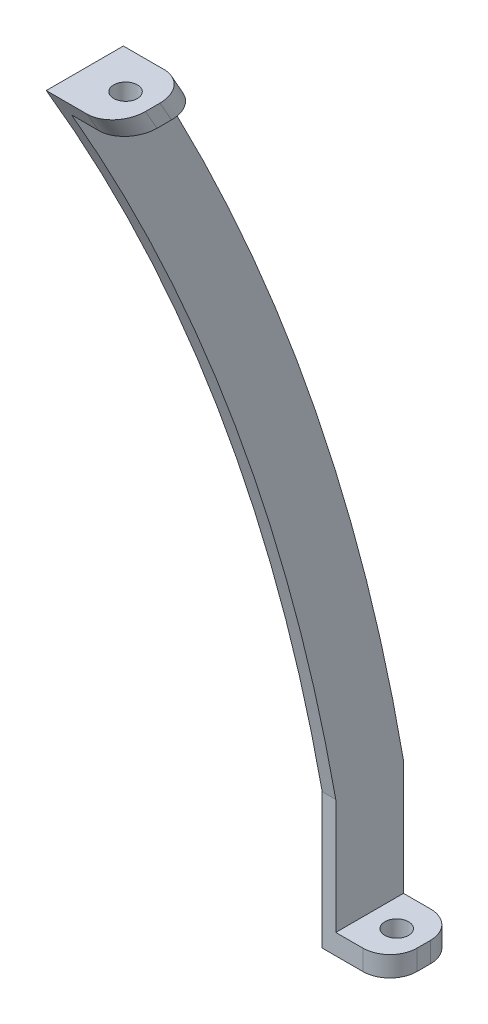
ISO-10303-21;
HEADER;
FILE_DESCRIPTION(('STEP AP214'),'2;1');
FILE_NAME('part.step','',(''),(''),'','','');
FILE_SCHEMA(('AUTOMOTIVE_DESIGN { 1 0 10303 214 1 1 1 1 }'));
ENDSEC;
DATA;
#1=APPLICATION_CONTEXT('core data for automotive mechanical design processes');
#2=APPLICATION_PROTOCOL_DEFINITION('international standard','automotive_design',2000,#1);
#3=PRODUCT_CONTEXT('',#1,'mechanical');
#4=PRODUCT('Part','Part','',(#3));
#5=PRODUCT_RELATED_PRODUCT_CATEGORY('part','',(#4));
#6=PRODUCT_DEFINITION_FORMATION('','',#4);
#7=PRODUCT_DEFINITION_CONTEXT('part definition',#1,'design');
#8=PRODUCT_DEFINITION('design','',#6,#7);
#9=PRODUCT_DEFINITION_SHAPE('','',#8);
#10=(LENGTH_UNIT() NAMED_UNIT(*) SI_UNIT(.MILLI.,.METRE.));
#11=(NAMED_UNIT(*) PLANE_ANGLE_UNIT() SI_UNIT($,.RADIAN.));
#12=(NAMED_UNIT(*) SI_UNIT($,.STERADIAN.) SOLID_ANGLE_UNIT());
#13=UNCERTAINTY_MEASURE_WITH_UNIT(LENGTH_MEASURE(1.E-05),#10,'distance_accuracy_value','');
#14=(GEOMETRIC_REPRESENTATION_CONTEXT(3) GLOBAL_UNCERTAINTY_ASSIGNED_CONTEXT((#13)) GLOBAL_UNIT_ASSIGNED_CONTEXT((#10,
#11,#12)) REPRESENTATION_CONTEXT('',''));
#15=CARTESIAN_POINT('',(0.,0.,0.));
#16=DIRECTION('',(0.,0.,1.));
#17=DIRECTION('',(1.,0.,0.));
#18=AXIS2_PLACEMENT_3D('',#15,#16,#17);
#19=CARTESIAN_POINT('',(2.,-37.6515685831569,324.556822155279));
#20=DIRECTION('',(1.,0.,0.));
#21=DIRECTION('',(0.,0.,-1.));
#22=AXIS2_PLACEMENT_3D('',#19,#20,#21);
#23=PLANE('',#22);
#24=CARTESIAN_POINT('',(2.,-37.6515685831569,324.556822155279));
#25=DIRECTION('',(1.,0.,0.));
#26=DIRECTION('',(0.,0.,-1.));
#27=AXIS2_PLACEMENT_3D('',#24,#25,#26);
#28=CIRCLE('',#27,339.487806276952);
#29=CARTESIAN_POINT('',(2.,20.,-10.));
#30=VERTEX_POINT('',#29);
#31=CARTESIAN_POINT('',(2.,127.,27.6699218483719));
#32=VERTEX_POINT('',#31);
#33=EDGE_CURVE('E193',#30,#32,#28,.T.);
#34=ORIENTED_EDGE('',*,*,#33,.T.);
#35=DIRECTION('',(0.,0.,-1.));
#36=VECTOR('',#35,1.);
#37=CARTESIAN_POINT('',(2.,127.,38.9859988368982));
#38=LINE('',#37,#36);
#39=CARTESIAN_POINT('',(2.,127.,38.9859988368982));
#40=VERTEX_POINT('',#39);
#41=EDGE_CURVE('E177',#40,#32,#38,.T.);
#42=ORIENTED_EDGE('',*,*,#41,.F.);
#43=CARTESIAN_POINT('',(2.,-37.6515685831569,324.556822155279));
#44=DIRECTION('',(-1.,0.,0.));
#45=DIRECTION('',(0.,0.,-1.));
#46=AXIS2_PLACEMENT_3D('',#43,#44,#45);
#47=CIRCLE('',#46,329.637428347619);
#48=CARTESIAN_POINT('',(2.,20.,0.));
#49=VERTEX_POINT('',#48);
#50=EDGE_CURVE('E167',#40,#49,#47,.T.);
#51=ORIENTED_EDGE('',*,*,#50,.T.);
#52=DIRECTION('',(0.,-1.,0.));
#53=VECTOR('',#52,1.);
#54=CARTESIAN_POINT('',(2.,0.,0.));
#55=LINE('',#54,#53);
#56=CARTESIAN_POINT('',(2.,3.,0.));
#57=VERTEX_POINT('',#56);
#58=EDGE_CURVE('E151',#49,#57,#55,.T.);
#59=ORIENTED_EDGE('',*,*,#58,.T.);
#60=DIRECTION('',(0.,0.,1.));
#61=VECTOR('',#60,1.);
#62=CARTESIAN_POINT('',(2.,3.,0.));
#63=LINE('',#62,#61);
#64=CARTESIAN_POINT('',(2.,3.,-10.));
#65=VERTEX_POINT('',#64);
#66=EDGE_CURVE('E163',#65,#57,#63,.T.);
#67=ORIENTED_EDGE('',*,*,#66,.F.);
#68=DIRECTION('',(0.,1.,0.));
#69=VECTOR('',#68,1.);
#70=CARTESIAN_POINT('',(2.,0.,-10.));
#71=LINE('',#70,#69);
#72=EDGE_CURVE('E170',#65,#30,#71,.T.);
#73=ORIENTED_EDGE('',*,*,#72,.T.);
#74=EDGE_LOOP('',(#34,#42,#51,#59,#67,#73));
#75=FACE_BOUND('',#74,.T.);
#76=ADVANCED_FACE('F43',(#75),#23,.T.);
#77=CARTESIAN_POINT('',(2.,0.,0.));
#78=DIRECTION('',(0.,0.,-1.));
#79=DIRECTION('',(-1.,0.,0.));
#80=AXIS2_PLACEMENT_3D('',#77,#78,#79);
#81=PLANE('',#80);
#82=DIRECTION('',(-1.,0.,0.));
#83=VECTOR('',#82,1.);
#84=CARTESIAN_POINT('',(2.,0.,0.));
#85=LINE('',#84,#83);
#86=CARTESIAN_POINT('',(6.,0.,0.));
#87=VERTEX_POINT('',#86);
#88=CARTESIAN_POINT('',(0.,0.,0.));
#89=VERTEX_POINT('',#88);
#90=EDGE_CURVE('E234',#87,#89,#85,.T.);
#91=ORIENTED_EDGE('',*,*,#90,.F.);
#92=DIRECTION('',(0.,-1.,0.));
#93=VECTOR('',#92,1.);
#94=CARTESIAN_POINT('',(6.,0.,0.));
#95=LINE('',#94,#93);
#96=CARTESIAN_POINT('',(6.,3.,0.));
#97=VERTEX_POINT('',#96);
#98=EDGE_CURVE('E11',#87,#97,#95,.F.);
#99=ORIENTED_EDGE('',*,*,#98,.T.);
#100=DIRECTION('',(-1.,0.,0.));
#101=VECTOR('',#100,1.);
#102=CARTESIAN_POINT('',(10.,3.,0.));
#103=LINE('',#102,#101);
#104=EDGE_CURVE('E147',#97,#57,#103,.T.);
#105=ORIENTED_EDGE('',*,*,#104,.T.);
#106=ORIENTED_EDGE('',*,*,#58,.F.);
#107=DIRECTION('',(-1.,0.,0.));
#108=VECTOR('',#107,1.);
#109=CARTESIAN_POINT('',(2.,20.,0.));
#110=LINE('',#109,#108);
#111=CARTESIAN_POINT('',(0.,20.,0.));
#112=VERTEX_POINT('',#111);
#113=EDGE_CURVE('E198',#49,#112,#110,.T.);
#114=ORIENTED_EDGE('',*,*,#113,.T.);
#115=DIRECTION('',(0.,-1.,0.));
#116=VECTOR('',#115,1.);
#117=CARTESIAN_POINT('',(0.,0.,0.));
#118=LINE('',#117,#116);
#119=EDGE_CURVE('E189',#112,#89,#118,.T.);
#120=ORIENTED_EDGE('',*,*,#119,.T.);
#121=EDGE_LOOP('',(#91,#99,#105,#106,#114,#120));
#122=FACE_BOUND('',#121,.T.);
#123=ADVANCED_FACE('F149',(#122),#81,.F.);
#124=CARTESIAN_POINT('',(2.,0.,0.));
#125=DIRECTION('',(0.,1.,0.));
#126=DIRECTION('',(0.,0.,1.));
#127=AXIS2_PLACEMENT_3D('',#124,#125,#126);
#128=PLANE('',#127);
#129=CARTESIAN_POINT('',(6.,0.,-5.));
#130=DIRECTION('',(0.,1.,0.));
#131=DIRECTION('',(0.,0.,1.));
#132=AXIS2_PLACEMENT_3D('',#129,#130,#131);
#133=CIRCLE('',#132,1.75);
#134=CARTESIAN_POINT('',(6.,0.,-3.25));
#135=VERTEX_POINT('',#134);
#136=EDGE_CURVE('E364',#135,#135,#133,.T.);
#137=ORIENTED_EDGE('',*,*,#136,.T.);
#138=EDGE_LOOP('',(#137));
#139=FACE_BOUND('',#138,.T.);
#140=DIRECTION('',(-1.,0.,0.));
#141=VECTOR('',#140,1.);
#142=CARTESIAN_POINT('',(2.,0.,-10.));
#143=LINE('',#142,#141);
#144=CARTESIAN_POINT('',(6.,0.,-10.));
#145=VERTEX_POINT('',#144);
#146=CARTESIAN_POINT('',(0.,0.,-10.));
#147=VERTEX_POINT('',#146);
#148=EDGE_CURVE('E231',#145,#147,#143,.T.);
#149=ORIENTED_EDGE('',*,*,#148,.F.);
#150=CARTESIAN_POINT('',(6.,0.,-6.));
#151=DIRECTION('',(0.,1.,0.));
#152=DIRECTION('',(0.,0.,1.));
#153=AXIS2_PLACEMENT_3D('',#150,#151,#152);
#154=CIRCLE('',#153,4.);
#155=CARTESIAN_POINT('',(10.,0.,-6.));
#156=VERTEX_POINT('',#155);
#157=EDGE_CURVE('E53',#145,#156,#154,.F.);
#158=ORIENTED_EDGE('',*,*,#157,.T.);
#159=DIRECTION('',(0.,0.,-1.));
#160=VECTOR('',#159,1.);
#161=CARTESIAN_POINT('',(10.,0.,0.));
#162=LINE('',#161,#160);
#163=CARTESIAN_POINT('',(10.,0.,-4.));
#164=VERTEX_POINT('',#163);
#165=EDGE_CURVE('E176',#164,#156,#162,.T.);
#166=ORIENTED_EDGE('',*,*,#165,.F.);
#167=CARTESIAN_POINT('',(6.,0.,-4.));
#168=DIRECTION('',(0.,1.,0.));
#169=DIRECTION('',(0.,0.,1.));
#170=AXIS2_PLACEMENT_3D('',#167,#168,#169);
#171=CIRCLE('',#170,4.);
#172=EDGE_CURVE('E61',#164,#87,#171,.F.);
#173=ORIENTED_EDGE('',*,*,#172,.T.);
#174=ORIENTED_EDGE('',*,*,#90,.T.);
#175=DIRECTION('',(0.,0.,-1.));
#176=VECTOR('',#175,1.);
#177=CARTESIAN_POINT('',(0.,0.,0.));
#178=LINE('',#177,#176);
#179=EDGE_CURVE('E202',#89,#147,#178,.T.);
#180=ORIENTED_EDGE('',*,*,#179,.T.);
#181=EDGE_LOOP('',(#149,#158,#166,#173,#174,#180));
#182=FACE_BOUND('',#181,.T.);
#183=ADVANCED_FACE('F279',(#139,#182),#128,.F.);
#184=CARTESIAN_POINT('',(2.,0.,-10.));
#185=DIRECTION('',(0.,0.,1.));
#186=DIRECTION('',(1.,0.,0.));
#187=AXIS2_PLACEMENT_3D('',#184,#185,#186);
#188=PLANE('',#187);
#189=DIRECTION('',(-1.,0.,0.));
#190=VECTOR('',#189,1.);
#191=CARTESIAN_POINT('',(10.,3.,-10.));
#192=LINE('',#191,#190);
#193=CARTESIAN_POINT('',(6.,3.,-10.));
#194=VERTEX_POINT('',#193);
#195=EDGE_CURVE('E157',#194,#65,#192,.T.);
#196=ORIENTED_EDGE('',*,*,#195,.F.);
#197=DIRECTION('',(0.,1.,0.));
#198=VECTOR('',#197,1.);
#199=CARTESIAN_POINT('',(6.,0.,-10.));
#200=LINE('',#199,#198);
#201=EDGE_CURVE('E69',#194,#145,#200,.F.);
#202=ORIENTED_EDGE('',*,*,#201,.T.);
#203=ORIENTED_EDGE('',*,*,#148,.T.);
#204=DIRECTION('',(0.,1.,0.));
#205=VECTOR('',#204,1.);
#206=CARTESIAN_POINT('',(0.,0.,-10.));
#207=LINE('',#206,#205);
#208=CARTESIAN_POINT('',(0.,20.,-10.));
#209=VERTEX_POINT('',#208);
#210=EDGE_CURVE('E206',#147,#209,#207,.T.);
#211=ORIENTED_EDGE('',*,*,#210,.T.);
#212=DIRECTION('',(-1.,0.,0.));
#213=VECTOR('',#212,1.);
#214=CARTESIAN_POINT('',(2.,20.,-10.));
#215=LINE('',#214,#213);
#216=EDGE_CURVE('E227',#30,#209,#215,.T.);
#217=ORIENTED_EDGE('',*,*,#216,.F.);
#218=ORIENTED_EDGE('',*,*,#72,.F.);
#219=EDGE_LOOP('',(#196,#202,#203,#211,#217,#218));
#220=FACE_BOUND('',#219,.T.);
#221=ADVANCED_FACE('F275',(#220),#188,.F.);
#222=CARTESIAN_POINT('',(2.,-37.6515685831569,324.556822155279));
#223=DIRECTION('',(-1.,0.,0.));
#224=DIRECTION('',(0.,0.,1.));
#225=AXIS2_PLACEMENT_3D('',#222,#223,#224);
#226=CYLINDRICAL_SURFACE('',#225,339.487806276952);
#227=DIRECTION('',(-1.,0.,0.));
#228=VECTOR('',#227,1.);
#229=CARTESIAN_POINT('',(2.,130.,29.3536342281421));
#230=LINE('',#229,#228);
#231=CARTESIAN_POINT('',(6.,130.,29.3536342281421));
#232=VERTEX_POINT('',#231);
#233=CARTESIAN_POINT('',(0.,130.,29.3536342281421));
#234=VERTEX_POINT('',#233);
#235=EDGE_CURVE('E224',#232,#234,#230,.T.);
#236=ORIENTED_EDGE('',*,*,#235,.F.);
#237=CARTESIAN_POINT('',(6.,-37.6515685831569,324.556822155279));
#238=DIRECTION('',(-1.,0.,0.));
#239=DIRECTION('',(0.,0.,1.));
#240=AXIS2_PLACEMENT_3D('',#237,#238,#239);
#241=CIRCLE('',#240,339.487806276952);
#242=CARTESIAN_POINT('',(6.,127.,27.6699218483719));
#243=VERTEX_POINT('',#242);
#244=EDGE_CURVE('E394',#232,#243,#241,.T.);
#245=ORIENTED_EDGE('',*,*,#244,.T.);
#246=DIRECTION('',(-1.,0.,0.));
#247=VECTOR('',#246,1.);
#248=CARTESIAN_POINT('',(10.,127.,27.6699218483719));
#249=LINE('',#248,#247);
#250=EDGE_CURVE('E380',#243,#32,#249,.T.);
#251=ORIENTED_EDGE('',*,*,#250,.T.);
#252=ORIENTED_EDGE('',*,*,#33,.F.);
#253=ORIENTED_EDGE('',*,*,#216,.T.);
#254=CARTESIAN_POINT('',(0.,-37.6515685831569,324.556822155279));
#255=DIRECTION('',(1.,0.,0.));
#256=DIRECTION('',(0.,0.,-1.));
#257=AXIS2_PLACEMENT_3D('',#254,#255,#256);
#258=CIRCLE('',#257,339.487806276952);
#259=EDGE_CURVE('E209',#209,#234,#258,.T.);
#260=ORIENTED_EDGE('',*,*,#259,.T.);
#261=EDGE_LOOP('',(#236,#245,#251,#252,#253,#260));
#262=FACE_BOUND('',#261,.T.);
#263=ADVANCED_FACE('F269',(#262),#226,.T.);
#264=CARTESIAN_POINT('',(2.,130.,40.7368339246421));
#265=DIRECTION('',(0.,-1.,0.));
#266=DIRECTION('',(0.,0.,-1.));
#267=AXIS2_PLACEMENT_3D('',#264,#265,#266);
#268=PLANE('',#267);
#269=CARTESIAN_POINT('',(6.,130.,35.0316774144296));
#270=DIRECTION('',(0.,1.,0.));
#271=DIRECTION('',(0.,0.,1.));
#272=AXIS2_PLACEMENT_3D('',#269,#270,#271);
#273=CIRCLE('',#272,1.75);
#274=CARTESIAN_POINT('',(6.,130.,36.7816774144296));
#275=VERTEX_POINT('',#274);
#276=EDGE_CURVE('E371',#275,#275,#273,.T.);
#277=ORIENTED_EDGE('',*,*,#276,.F.);
#278=EDGE_LOOP('',(#277));
#279=FACE_BOUND('',#278,.T.);
#280=DIRECTION('',(0.,0.,1.));
#281=VECTOR('',#280,1.);
#282=CARTESIAN_POINT('',(10.,130.,40.7368339246421));
#283=LINE('',#282,#281);
#284=CARTESIAN_POINT('',(10.,130.,33.9625694383182));
#285=VERTEX_POINT('',#284);
#286=CARTESIAN_POINT('',(10.,130.,36.1007853905411));
#287=VERTEX_POINT('',#286);
#288=EDGE_CURVE('E382',#285,#287,#283,.T.);
#289=ORIENTED_EDGE('',*,*,#288,.F.);
#290=CARTESIAN_POINT('',(10.,130.,33.9625694383182));
#291=CARTESIAN_POINT('',(10.0000016890066,130.,33.7921779177717));
#292=CARTESIAN_POINT('',(9.99183105610014,130.,33.621770066533));
#293=CARTESIAN_POINT('',(9.95911845901249,130.,33.2824069455999));
#294=CARTESIAN_POINT('',(9.93456424428189,130.,33.1134528587581));
#295=CARTESIAN_POINT('',(9.86887134074454,130.,32.7777900146347));
#296=CARTESIAN_POINT('',(9.82763906414067,130.,32.6110995077267));
#297=CARTESIAN_POINT('',(9.72858406722922,130.,32.2826446795105));
#298=CARTESIAN_POINT('',(9.6707567628319,130.,32.1208817330318));
#299=CARTESIAN_POINT('',(9.54811654030155,130.,31.8270204513541));
#300=CARTESIAN_POINT('',(9.48550363348648,130.,31.6940011374607));
#301=CARTESIAN_POINT('',(9.34830721461339,130.,31.4342892008479));
#302=CARTESIAN_POINT('',(9.2737257399671,130.,31.3075955061213));
#303=CARTESIAN_POINT('',(9.11300637773483,130.,31.0622153490415));
#304=CARTESIAN_POINT('',(9.02689887700795,130.,30.9435090252543));
#305=CARTESIAN_POINT('',(8.84332557645081,130.,30.7152201746812));
#306=CARTESIAN_POINT('',(8.74586139139372,130.,30.6056363545833));
#307=CARTESIAN_POINT('',(8.55159222481803,130.,30.4087820135206));
#308=CARTESIAN_POINT('',(8.45592687169519,130.,30.3203860777673));
#309=CARTESIAN_POINT('',(8.25658661420875,130.,30.1531562050345));
#310=CARTESIAN_POINT('',(8.15291355795019,130.,30.0743200724694));
#311=CARTESIAN_POINT('',(7.93834464854189,130.,29.9273969199274));
#312=CARTESIAN_POINT('',(7.82745590323945,130.,29.8592995415103));
#313=CARTESIAN_POINT('',(7.59932373203368,130.,29.7348925727375));
#314=CARTESIAN_POINT('',(7.48208458136972,130.,29.6785751730073));
#315=CARTESIAN_POINT('',(7.25494145936311,130.,29.5839399751506));
#316=CARTESIAN_POINT('',(7.14556610104366,130.,29.5443509006106));
#317=CARTESIAN_POINT('',(6.9235024908058,130.,29.4759669841441));
#318=CARTESIAN_POINT('',(6.81081487832653,130.,29.4471700733322));
#319=CARTESIAN_POINT('',(6.58241508153863,130.,29.4006941971859));
#320=CARTESIAN_POINT('',(6.46668818801474,130.,29.3830873316451));
#321=CARTESIAN_POINT('',(6.23397953746154,130.,29.3595357083424));
#322=CARTESIAN_POINT('',(6.11699700852846,130.,29.3535985927681));
#323=CARTESIAN_POINT('',(5.99999999999999,130.,29.3536342281422));
#324=B_SPLINE_CURVE_WITH_KNOTS('',3,(#290,#291,#292,#293,#294,#295,#296,#297,#298,#299,#300,
#301,#302,#303,#304,#305,#306,#307,#308,#309,#310,#311,#312,#313,#314,#315,#316,#317,#318,#319,
#320,#321,#322,#323),.UNSPECIFIED.,.F.,.F.,(4,2,2,2,2,2,2,2,2,2,2,2,2,2,2,2,4),(0.,
0.511006024540308,1.02239457412156,1.5366934611652,2.05113455136533,2.49160551261003,
2.93200157177774,3.37125864801391,3.81045334363185,4.20064802992955,4.59075293038627,
4.98047920900704,5.36994629933397,5.71837897095335,6.06674481292258,6.41733308156501,
6.76815086410762),.UNSPECIFIED.);
#325=EDGE_CURVE('E254',#285,#232,#324,.T.);
#326=ORIENTED_EDGE('',*,*,#325,.T.);
#327=ORIENTED_EDGE('',*,*,#235,.T.);
#328=DIRECTION('',(0.,0.,1.));
#329=VECTOR('',#328,1.);
#330=CARTESIAN_POINT('',(0.,130.,40.7368339246421));
#331=LINE('',#330,#329);
#332=CARTESIAN_POINT('',(0.,130.,40.7368339246421));
#333=VERTEX_POINT('',#332);
#334=EDGE_CURVE('E213',#234,#333,#331,.T.);
#335=ORIENTED_EDGE('',*,*,#334,.T.);
#336=DIRECTION('',(-1.,0.,0.));
#337=VECTOR('',#336,1.);
#338=CARTESIAN_POINT('',(2.,130.,40.7368339246421));
#339=LINE('',#338,#337);
#340=CARTESIAN_POINT('',(6.,130.,40.7368339246421));
#341=VERTEX_POINT('',#340);
#342=EDGE_CURVE('E221',#341,#333,#339,.T.);
#343=ORIENTED_EDGE('',*,*,#342,.F.);
#344=CARTESIAN_POINT('',(6.,130.,40.7368339246421));
#345=CARTESIAN_POINT('',(6.10138933184662,130.,40.7368555534072));
#346=CARTESIAN_POINT('',(6.20277090177958,130.,40.7323576489407));
#347=CARTESIAN_POINT('',(6.40471422590569,130.,40.7144833561885));
#348=CARTESIAN_POINT('',(6.50527625192567,130.,40.7011100440409));
#349=CARTESIAN_POINT('',(6.70440971608126,130.,40.6657231117066));
#350=CARTESIAN_POINT('',(6.80298795187582,130.,40.6437476566446));
#351=CARTESIAN_POINT('',(6.9979039597055,130.,40.5914495887771));
#352=CARTESIAN_POINT('',(7.0942416273212,130.,40.5611265877845));
#353=CARTESIAN_POINT('',(7.2839180607252,130.,40.4925471868538));
#354=CARTESIAN_POINT('',(7.37726033135845,130.,40.4543004805923));
#355=CARTESIAN_POINT('',(7.56051712777168,130.,40.3702998438789));
#356=CARTESIAN_POINT('',(7.65043034396651,130.,40.3245430799629));
#357=CARTESIAN_POINT('',(7.91432977603472,130.,40.176685265323));
#358=CARTESIAN_POINT('',(8.08250072034838,130.,40.0639875305483));
#359=CARTESIAN_POINT('',(8.40847072478643,130.,39.8080925205534));
#360=CARTESIAN_POINT('',(8.56522767450206,130.,39.6635822841357));
#361=CARTESIAN_POINT('',(8.85569740003443,130.,39.3530897032331));
#362=CARTESIAN_POINT('',(8.98940550243889,130.,39.1871030160727));
#363=CARTESIAN_POINT('',(9.2485926130084,130.,38.8152189862062));
#364=CARTESIAN_POINT('',(9.37065808087341,130.,38.6069453712043));
#365=CARTESIAN_POINT('',(9.58290576048547,130.,38.1745883111799));
#366=CARTESIAN_POINT('',(9.67305001229358,130.,37.9504864206999));
#367=CARTESIAN_POINT('',(9.83134222497634,130.,37.4597353106119));
#368=CARTESIAN_POINT('',(9.89464424350386,130.,37.1915217055874));
#369=CARTESIAN_POINT('',(9.97894442590361,130.,36.6490599429297));
#370=CARTESIAN_POINT('',(10.0000278231842,130.,36.3748250759308));
#371=CARTESIAN_POINT('',(10.,130.,36.1007853905411));
#372=B_SPLINE_CURVE_WITH_KNOTS('',3,(#344,#345,#346,#347,#348,#349,#350,#351,#352,#353,#354,
#355,#356,#357,#358,#359,#360,#361,#362,#363,#364,#365,#366,#367,#368,#369,#370,#371),
.UNSPECIFIED.,.F.,.F.,(4,2,2,2,2,2,2,2,2,2,2,2,2,4),(0.,0.304056134386741,0.608006940590299,
0.910624220419885,1.21325557527804,1.51551886137913,1.81789645142933,2.42257283913892,
3.05972433312651,3.69700486515488,4.41837084272952,5.14059179309399,5.96391808479955,
6.78558051490896),.UNSPECIFIED.);
#373=EDGE_CURVE('E245',#341,#287,#372,.T.);
#374=ORIENTED_EDGE('',*,*,#373,.T.);
#375=EDGE_LOOP('',(#289,#326,#327,#335,#343,#374));
#376=FACE_BOUND('',#375,.T.);
#377=ADVANCED_FACE('F263',(#279,#376),#268,.F.);
#378=CARTESIAN_POINT('',(2.,-37.6515685831569,324.556822155279));
#379=DIRECTION('',(-1.,0.,0.));
#380=DIRECTION('',(0.,0.,1.));
#381=AXIS2_PLACEMENT_3D('',#378,#379,#380);
#382=CYLINDRICAL_SURFACE('',#381,329.637428347619);
#383=DIRECTION('',(-1.,0.,0.));
#384=VECTOR('',#383,1.);
#385=CARTESIAN_POINT('',(10.,127.,38.9859988368982));
#386=LINE('',#385,#384);
#387=CARTESIAN_POINT('',(6.,127.,38.9859988368982));
#388=VERTEX_POINT('',#387);
#389=EDGE_CURVE('E369',#388,#40,#386,.T.);
#390=ORIENTED_EDGE('',*,*,#389,.F.);
#391=CARTESIAN_POINT('',(6.,-37.6515685831569,324.556822155279));
#392=DIRECTION('',(-1.,0.,0.));
#393=DIRECTION('',(0.,0.,1.));
#394=AXIS2_PLACEMENT_3D('',#391,#392,#393);
#395=CIRCLE('',#394,329.637428347619);
#396=EDGE_CURVE('E300',#388,#341,#395,.F.);
#397=ORIENTED_EDGE('',*,*,#396,.T.);
#398=ORIENTED_EDGE('',*,*,#342,.T.);
#399=CARTESIAN_POINT('',(0.,-37.6515685831569,324.556822155279));
#400=DIRECTION('',(-1.,0.,0.));
#401=DIRECTION('',(0.,0.,-1.));
#402=AXIS2_PLACEMENT_3D('',#399,#400,#401);
#403=CIRCLE('',#402,329.637428347619);
#404=EDGE_CURVE('E171',#333,#112,#403,.T.);
#405=ORIENTED_EDGE('',*,*,#404,.T.);
#406=ORIENTED_EDGE('',*,*,#113,.F.);
#407=ORIENTED_EDGE('',*,*,#50,.F.);
#408=EDGE_LOOP('',(#390,#397,#398,#405,#406,#407));
#409=FACE_BOUND('',#408,.T.);
#410=ADVANCED_FACE('F268',(#409),#382,.F.);
#411=CARTESIAN_POINT('',(0.,-37.6515685831569,324.556822155279));
#412=DIRECTION('',(1.,0.,0.));
#413=DIRECTION('',(0.,0.,-1.));
#414=AXIS2_PLACEMENT_3D('',#411,#412,#413);
#415=PLANE('',#414);
#416=ORIENTED_EDGE('',*,*,#119,.F.);
#417=ORIENTED_EDGE('',*,*,#404,.F.);
#418=ORIENTED_EDGE('',*,*,#334,.F.);
#419=ORIENTED_EDGE('',*,*,#259,.F.);
#420=ORIENTED_EDGE('',*,*,#210,.F.);
#421=ORIENTED_EDGE('',*,*,#179,.F.);
#422=EDGE_LOOP('',(#416,#417,#418,#419,#420,#421));
#423=FACE_BOUND('',#422,.T.);
#424=ADVANCED_FACE('F325',(#423),#415,.F.);
#425=CARTESIAN_POINT('',(10.,3.,0.));
#426=DIRECTION('',(0.,-1.,0.));
#427=DIRECTION('',(0.,0.,-1.));
#428=AXIS2_PLACEMENT_3D('',#425,#426,#427);
#429=PLANE('',#428);
#430=CARTESIAN_POINT('',(6.,3.,-5.));
#431=DIRECTION('',(0.,-1.,0.));
#432=DIRECTION('',(0.,0.,-1.));
#433=AXIS2_PLACEMENT_3D('',#430,#431,#432);
#434=CIRCLE('',#433,1.75);
#435=CARTESIAN_POINT('',(6.,3.,-6.75));
#436=VERTEX_POINT('',#435);
#437=EDGE_CURVE('E47',#436,#436,#434,.T.);
#438=ORIENTED_EDGE('',*,*,#437,.T.);
#439=EDGE_LOOP('',(#438));
#440=FACE_BOUND('',#439,.T.);
#441=DIRECTION('',(0.,0.,1.));
#442=VECTOR('',#441,1.);
#443=CARTESIAN_POINT('',(10.,3.,0.));
#444=LINE('',#443,#442);
#445=CARTESIAN_POINT('',(10.,3.,-6.));
#446=VERTEX_POINT('',#445);
#447=CARTESIAN_POINT('',(10.,3.,-4.));
#448=VERTEX_POINT('',#447);
#449=EDGE_CURVE('E158',#446,#448,#444,.T.);
#450=ORIENTED_EDGE('',*,*,#449,.F.);
#451=CARTESIAN_POINT('',(6.,3.,-6.));
#452=DIRECTION('',(0.,-1.,0.));
#453=DIRECTION('',(0.,0.,-1.));
#454=AXIS2_PLACEMENT_3D('',#451,#452,#453);
#455=CIRCLE('',#454,4.);
#456=EDGE_CURVE('E412',#446,#194,#455,.F.);
#457=ORIENTED_EDGE('',*,*,#456,.T.);
#458=ORIENTED_EDGE('',*,*,#195,.T.);
#459=ORIENTED_EDGE('',*,*,#66,.T.);
#460=ORIENTED_EDGE('',*,*,#104,.F.);
#461=CARTESIAN_POINT('',(6.,3.,-4.));
#462=DIRECTION('',(0.,-1.,0.));
#463=DIRECTION('',(0.,0.,-1.));
#464=AXIS2_PLACEMENT_3D('',#461,#462,#463);
#465=CIRCLE('',#464,4.);
#466=EDGE_CURVE('E407',#97,#448,#465,.F.);
#467=ORIENTED_EDGE('',*,*,#466,.T.);
#468=EDGE_LOOP('',(#450,#457,#458,#459,#460,#467));
#469=FACE_BOUND('',#468,.T.);
#470=ADVANCED_FACE('F174',(#440,#469),#429,.F.);
#471=CARTESIAN_POINT('',(10.,0.,0.));
#472=DIRECTION('',(-1.,0.,0.));
#473=DIRECTION('',(0.,0.,1.));
#474=AXIS2_PLACEMENT_3D('',#471,#472,#473);
#475=PLANE('',#474);
#476=ORIENTED_EDGE('',*,*,#165,.T.);
#477=DIRECTION('',(0.,1.,0.));
#478=VECTOR('',#477,1.);
#479=CARTESIAN_POINT('',(10.,0.,-6.));
#480=LINE('',#479,#478);
#481=EDGE_CURVE('E355',#156,#446,#480,.T.);
#482=ORIENTED_EDGE('',*,*,#481,.T.);
#483=ORIENTED_EDGE('',*,*,#449,.T.);
#484=DIRECTION('',(0.,-1.,0.));
#485=VECTOR('',#484,1.);
#486=CARTESIAN_POINT('',(10.,0.,-4.));
#487=LINE('',#486,#485);
#488=EDGE_CURVE('E401',#448,#164,#487,.T.);
#489=ORIENTED_EDGE('',*,*,#488,.T.);
#490=EDGE_LOOP('',(#476,#482,#483,#489));
#491=FACE_BOUND('',#490,.T.);
#492=ADVANCED_FACE('F312',(#491),#475,.F.);
#493=CARTESIAN_POINT('',(10.,127.,38.9859988368982));
#494=DIRECTION('',(0.,1.,0.));
#495=DIRECTION('',(0.,0.,1.));
#496=AXIS2_PLACEMENT_3D('',#493,#494,#495);
#497=PLANE('',#496);
#498=CARTESIAN_POINT('',(6.,127.,35.0316774144296));
#499=DIRECTION('',(0.,1.,0.));
#500=DIRECTION('',(0.,0.,1.));
#501=AXIS2_PLACEMENT_3D('',#498,#499,#500);
#502=CIRCLE('',#501,1.75);
#503=CARTESIAN_POINT('',(6.,127.,36.7816774144296));
#504=VERTEX_POINT('',#503);
#505=EDGE_CURVE('E361',#504,#504,#502,.T.);
#506=ORIENTED_EDGE('',*,*,#505,.T.);
#507=EDGE_LOOP('',(#506));
#508=FACE_BOUND('',#507,.T.);
#509=ORIENTED_EDGE('',*,*,#250,.F.);
#510=CARTESIAN_POINT('',(6.,127.,27.6699218483719));
#511=CARTESIAN_POINT('',(6.10237270038703,127.,27.6699013919176));
#512=CARTESIAN_POINT('',(6.20473836910855,127.,27.6744149463001));
#513=CARTESIAN_POINT('',(6.40865453393309,127.,27.6923585208443));
#514=CARTESIAN_POINT('',(6.51020527199374,127.,27.7057857872461));
#515=CARTESIAN_POINT('',(6.71135076918551,127.,27.7413340261737));
#516=CARTESIAN_POINT('',(6.81095173617799,127.,27.7634199415932));
#517=CARTESIAN_POINT('',(7.00790576751168,127.,27.8160064611431));
#518=CARTESIAN_POINT('',(7.10525874465126,127.,27.8465073911075));
#519=CARTESIAN_POINT('',(7.29696480665881,127.,27.9155329036395));
#520=CARTESIAN_POINT('',(7.39132088179584,127.,27.954049178908));
#521=CARTESIAN_POINT('',(7.57656956959253,127.,28.0386909720519));
#522=CARTESIAN_POINT('',(7.66746086624508,127.,28.084819346427));
#523=CARTESIAN_POINT('',(7.93419220615377,127.,28.2339569855992));
#524=CARTESIAN_POINT('',(8.1041383355636,127.,28.3477365312176));
#525=CARTESIAN_POINT('',(8.43246794071079,127.,28.6057114080155));
#526=CARTESIAN_POINT('',(8.58989451822262,127.,28.7511117435873));
#527=CARTESIAN_POINT('',(8.88126239853235,127.,29.063726703633));
#528=CARTESIAN_POINT('',(9.01519895990856,127.,29.2309457203204));
#529=CARTESIAN_POINT('',(9.27263719335098,127.,29.603466621014));
#530=CARTESIAN_POINT('',(9.39300325142126,127.,29.8109324910746));
#531=CARTESIAN_POINT('',(9.60166797294556,127.,30.241552443404));
#532=CARTESIAN_POINT('',(9.68993088638514,127.,30.4647236872207));
#533=CARTESIAN_POINT('',(9.84132629492616,127.,30.9449650425377));
#534=CARTESIAN_POINT('',(9.90091015326141,127.,31.2031524126821));
#535=CARTESIAN_POINT('',(9.98022566610159,127.,31.7250619214519));
#536=CARTESIAN_POINT('',(10.0000380392449,127.,31.9887717498618));
#537=CARTESIAN_POINT('',(10.,127.,32.2523077809235));
#538=B_SPLINE_CURVE_WITH_KNOTS('',3,(#510,#511,#512,#513,#514,#515,#516,#517,#518,#519,#520,
#521,#522,#523,#524,#525,#526,#527,#528,#529,#530,#531,#532,#533,#534,#535,#536,#537),
.UNSPECIFIED.,.F.,.F.,(4,2,2,2,2,2,2,2,2,2,2,2,2,4),(0.,0.307007673401825,0.613920545420755,
0.919603414017134,1.22529812048387,1.53067756150801,1.83617186024036,2.44700694636124,
3.08738806088074,3.7278982868955,4.44458663079051,5.16207065175911,5.95384971024064,
6.74402017384692),.UNSPECIFIED.);
#539=CARTESIAN_POINT('',(10.,127.,32.2523077809235));
#540=VERTEX_POINT('',#539);
#541=EDGE_CURVE('E291',#243,#540,#538,.T.);
#542=ORIENTED_EDGE('',*,*,#541,.T.);
#543=DIRECTION('',(0.,0.,-1.));
#544=VECTOR('',#543,1.);
#545=CARTESIAN_POINT('',(10.,127.,38.9859988368982));
#546=LINE('',#545,#544);
#547=CARTESIAN_POINT('',(10.,127.,34.3779212036096));
#548=VERTEX_POINT('',#547);
#549=EDGE_CURVE('E184',#548,#540,#546,.T.);
#550=ORIENTED_EDGE('',*,*,#549,.F.);
#551=CARTESIAN_POINT('',(10.,127.,34.3779212036096));
#552=CARTESIAN_POINT('',(10.0000018208522,127.,34.5483951797118));
#553=CARTESIAN_POINT('',(9.99175589332934,127.,34.7188810345579));
#554=CARTESIAN_POINT('',(9.95878819214889,127.,35.0583688084536));
#555=CARTESIAN_POINT('',(9.93405507256737,127.,35.227369624349));
#556=CARTESIAN_POINT('',(9.86795764856864,127.,35.5630292983674));
#557=CARTESIAN_POINT('',(9.82650570977514,127.,35.729670950435));
#558=CARTESIAN_POINT('',(9.72700746643326,127.,36.0580023204697));
#559=CARTESIAN_POINT('',(9.66895651644395,127.,36.2196906381399));
#560=CARTESIAN_POINT('',(9.54613057063568,127.,36.5129211146564));
#561=CARTESIAN_POINT('',(9.48359403827966,127.,36.6454040439288));
#562=CARTESIAN_POINT('',(9.34667101120167,127.,36.9040949248881));
#563=CARTESIAN_POINT('',(9.27228647891757,127.,37.0303039112221));
#564=CARTESIAN_POINT('',(9.11207029021663,127.,37.2748174049001));
#565=CARTESIAN_POINT('',(9.02626649606322,127.,37.3931401317348));
#566=CARTESIAN_POINT('',(8.84341463815169,127.,37.6207636245194));
#567=CARTESIAN_POINT('',(8.74636805377893,127.,37.7300655742366));
#568=CARTESIAN_POINT('',(8.55237822860797,127.,37.9271145904425));
#569=CARTESIAN_POINT('',(8.4565083493559,127.,38.015918830642));
#570=CARTESIAN_POINT('',(8.25671733475008,127.,38.1839392130626));
#571=CARTESIAN_POINT('',(8.15279806429049,127.,38.2631575653228));
#572=CARTESIAN_POINT('',(7.93770320987702,127.,38.4107906074914));
#573=CARTESIAN_POINT('',(7.82653578374075,127.,38.4792171567544));
#574=CARTESIAN_POINT('',(7.59779766609802,127.,38.6042166592638));
#575=CARTESIAN_POINT('',(7.48023136245877,127.,38.6607976094519));
#576=CARTESIAN_POINT('',(7.25293804942501,127.,38.755631032312));
#577=CARTESIAN_POINT('',(7.14376452568184,127.,38.7952127943756));
#578=CARTESIAN_POINT('',(6.92210344279155,127.,38.8635959655673));
#579=CARTESIAN_POINT('',(6.8096165545814,127.,38.892399541246));
#580=CARTESIAN_POINT('',(6.5815876007261,127.,38.9388987120403));
#581=CARTESIAN_POINT('',(6.46603023646536,127.,38.9565194879264));
#582=CARTESIAN_POINT('',(6.23365415137927,127.,38.9800917735654));
#583=CARTESIAN_POINT('',(6.11683462368021,127.,38.9860353126884));
#584=CARTESIAN_POINT('',(6.00000000000001,127.,38.9859988368983));
#585=B_SPLINE_CURVE_WITH_KNOTS('',3,(#551,#552,#553,#554,#555,#556,#557,#558,#559,#560,#561,
#562,#563,#564,#565,#566,#567,#568,#569,#570,#571,#572,#573,#574,#575,#576,#577,#578,#579,#580,
#581,#582,#583,#584),.UNSPECIFIED.,.F.,.F.,(4,2,2,2,2,2,2,2,2,2,2,2,2,2,2,2,4),(0.,
0.511243371284074,1.02283892654316,1.53715168437257,2.05160852017632,2.49053526523847,
2.92938938433395,3.36719171427087,3.80493650117235,4.19641095708891,4.58779498539014,
4.97874587020422,5.36943196761391,5.71728912999362,6.06507633111507,6.41516655244729,
6.76549565490623),.UNSPECIFIED.);
#586=EDGE_CURVE('E301',#548,#388,#585,.T.);
#587=ORIENTED_EDGE('',*,*,#586,.T.);
#588=ORIENTED_EDGE('',*,*,#389,.T.);
#589=ORIENTED_EDGE('',*,*,#41,.T.);
#590=EDGE_LOOP('',(#509,#542,#550,#587,#588,#589));
#591=FACE_BOUND('',#590,.T.);
#592=ADVANCED_FACE('F307',(#508,#591),#497,.F.);
#593=CARTESIAN_POINT('',(10.,-37.6515685877969,324.556822163228));
#594=DIRECTION('',(-1.,0.,0.));
#595=DIRECTION('',(0.,0.,1.));
#596=AXIS2_PLACEMENT_3D('',#593,#594,#595);
#597=PLANE('',#596);
#598=ORIENTED_EDGE('',*,*,#549,.T.);
#599=CARTESIAN_POINT('',(10.,-37.6515685831569,324.556822155279));
#600=DIRECTION('',(-1.,0.,0.));
#601=DIRECTION('',(0.,0.,1.));
#602=AXIS2_PLACEMENT_3D('',#599,#600,#601);
#603=CIRCLE('',#602,335.487806276952);
#604=EDGE_CURVE('E241',#540,#285,#603,.F.);
#605=ORIENTED_EDGE('',*,*,#604,.T.);
#606=ORIENTED_EDGE('',*,*,#288,.T.);
#607=CARTESIAN_POINT('',(10.,-37.6515685831569,324.556822155279));
#608=DIRECTION('',(-1.,0.,0.));
#609=DIRECTION('',(0.,0.,1.));
#610=AXIS2_PLACEMENT_3D('',#607,#608,#609);
#611=CIRCLE('',#610,333.637428347619);
#612=EDGE_CURVE('E237',#287,#548,#611,.T.);
#613=ORIENTED_EDGE('',*,*,#612,.T.);
#614=EDGE_LOOP('',(#598,#605,#606,#613));
#615=FACE_BOUND('',#614,.T.);
#616=ADVANCED_FACE('F287',(#615),#597,.F.);
#617=CARTESIAN_POINT('',(6.,-37.6515685831569,324.556822155279));
#618=DIRECTION('',(-1.,0.,0.));
#619=DIRECTION('',(0.,0.,1.));
#620=AXIS2_PLACEMENT_3D('',#617,#618,#619);
#621=TOROIDAL_SURFACE('',#620,335.487806276952,4.);
#622=ORIENTED_EDGE('',*,*,#541,.F.);
#623=ORIENTED_EDGE('',*,*,#244,.F.);
#624=ORIENTED_EDGE('',*,*,#325,.F.);
#625=ORIENTED_EDGE('',*,*,#604,.F.);
#626=EDGE_LOOP('',(#622,#623,#624,#625));
#627=FACE_BOUND('',#626,.T.);
#628=ADVANCED_FACE('F284',(#627),#621,.T.);
#629=CARTESIAN_POINT('',(6.,-37.6515685831569,324.556822155279));
#630=DIRECTION('',(-1.,0.,0.));
#631=DIRECTION('',(0.,0.,1.));
#632=AXIS2_PLACEMENT_3D('',#629,#630,#631);
#633=TOROIDAL_SURFACE('',#632,333.637428347619,4.);
#634=ORIENTED_EDGE('',*,*,#373,.F.);
#635=ORIENTED_EDGE('',*,*,#396,.F.);
#636=ORIENTED_EDGE('',*,*,#586,.F.);
#637=ORIENTED_EDGE('',*,*,#612,.F.);
#638=EDGE_LOOP('',(#634,#635,#636,#637));
#639=FACE_BOUND('',#638,.T.);
#640=ADVANCED_FACE('F261',(#639),#633,.T.);
#641=CARTESIAN_POINT('',(6.,0.,-6.));
#642=DIRECTION('',(0.,1.,0.));
#643=DIRECTION('',(0.,0.,1.));
#644=AXIS2_PLACEMENT_3D('',#641,#642,#643);
#645=CYLINDRICAL_SURFACE('',#644,4.);
#646=ORIENTED_EDGE('',*,*,#157,.F.);
#647=ORIENTED_EDGE('',*,*,#201,.F.);
#648=ORIENTED_EDGE('',*,*,#456,.F.);
#649=ORIENTED_EDGE('',*,*,#481,.F.);
#650=EDGE_LOOP('',(#646,#647,#648,#649));
#651=FACE_BOUND('',#650,.T.);
#652=ADVANCED_FACE('F353',(#651),#645,.T.);
#653=CARTESIAN_POINT('',(6.,0.,-4.));
#654=DIRECTION('',(0.,-1.,0.));
#655=DIRECTION('',(0.,0.,-1.));
#656=AXIS2_PLACEMENT_3D('',#653,#654,#655);
#657=CYLINDRICAL_SURFACE('',#656,4.);
#658=ORIENTED_EDGE('',*,*,#466,.F.);
#659=ORIENTED_EDGE('',*,*,#98,.F.);
#660=ORIENTED_EDGE('',*,*,#172,.F.);
#661=ORIENTED_EDGE('',*,*,#488,.F.);
#662=EDGE_LOOP('',(#658,#659,#660,#661));
#663=FACE_BOUND('',#662,.T.);
#664=ADVANCED_FACE('F45',(#663),#657,.T.);
#665=CARTESIAN_POINT('',(6.,0.,35.0316774144296));
#666=DIRECTION('',(0.,1.,0.));
#667=DIRECTION('',(0.,0.,1.));
#668=AXIS2_PLACEMENT_3D('',#665,#666,#667);
#669=CYLINDRICAL_SURFACE('',#668,1.75);
#670=ORIENTED_EDGE('',*,*,#276,.T.);
#671=EDGE_LOOP('',(#670));
#672=FACE_BOUND('',#671,.T.);
#673=ORIENTED_EDGE('',*,*,#505,.F.);
#674=EDGE_LOOP('',(#673));
#675=FACE_BOUND('',#674,.T.);
#676=ADVANCED_FACE('F314',(#672,#675),#669,.F.);
#677=CARTESIAN_POINT('',(6.,0.,-5.));
#678=DIRECTION('',(0.,1.,0.));
#679=DIRECTION('',(0.,0.,1.));
#680=AXIS2_PLACEMENT_3D('',#677,#678,#679);
#681=CYLINDRICAL_SURFACE('',#680,1.75);
#682=ORIENTED_EDGE('',*,*,#136,.F.);
#683=EDGE_LOOP('',(#682));
#684=FACE_BOUND('',#683,.T.);
#685=ORIENTED_EDGE('',*,*,#437,.F.);
#686=EDGE_LOOP('',(#685));
#687=FACE_BOUND('',#686,.T.);
#688=ADVANCED_FACE('F422',(#684,#687),#681,.F.);
#689=CLOSED_SHELL('',(#76,#123,#183,#221,#263,#377,#410,#424,#470,#492,#592,#616,#628,#640,#652,
#664,#676,#688));
#690=MANIFOLD_SOLID_BREP('B2',#689);
#691=ADVANCED_BREP_SHAPE_REPRESENTATION('',(#18,#690),#14);
#692=SHAPE_DEFINITION_REPRESENTATION(#9,#691);
ENDSEC;
END-ISO-10303-21;
